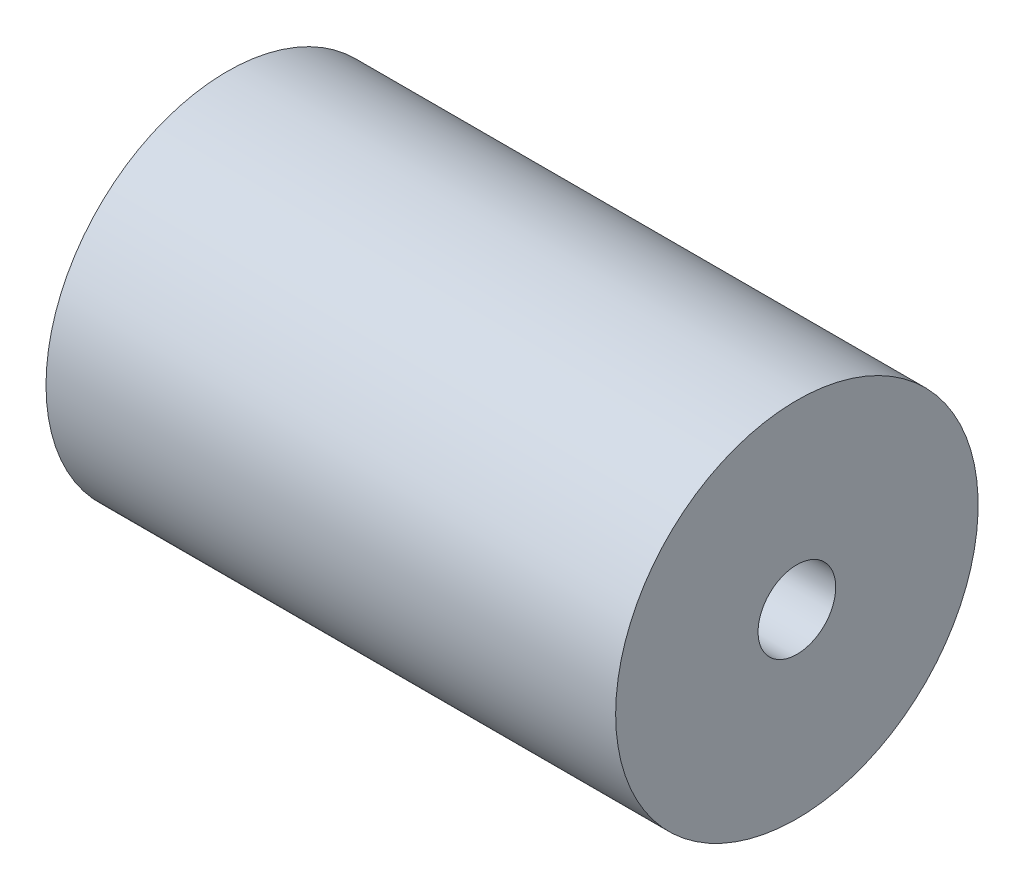
ISO-10303-21;
HEADER;
FILE_DESCRIPTION(('STEP AP214'),'2;1');
FILE_NAME('part.step','',(''),(''),'','','');
FILE_SCHEMA(('AUTOMOTIVE_DESIGN { 1 0 10303 214 1 1 1 1 }'));
ENDSEC;
DATA;
#1=APPLICATION_CONTEXT('core data for automotive mechanical design processes');
#2=APPLICATION_PROTOCOL_DEFINITION('international standard','automotive_design',2000,#1);
#3=PRODUCT_CONTEXT('',#1,'mechanical');
#4=PRODUCT('Part','Part','',(#3));
#5=PRODUCT_RELATED_PRODUCT_CATEGORY('part','',(#4));
#6=PRODUCT_DEFINITION_FORMATION('','',#4);
#7=PRODUCT_DEFINITION_CONTEXT('part definition',#1,'design');
#8=PRODUCT_DEFINITION('design','',#6,#7);
#9=PRODUCT_DEFINITION_SHAPE('','',#8);
#10=(LENGTH_UNIT() NAMED_UNIT(*) SI_UNIT(.MILLI.,.METRE.));
#11=(NAMED_UNIT(*) PLANE_ANGLE_UNIT() SI_UNIT($,.RADIAN.));
#12=(NAMED_UNIT(*) SI_UNIT($,.STERADIAN.) SOLID_ANGLE_UNIT());
#13=UNCERTAINTY_MEASURE_WITH_UNIT(LENGTH_MEASURE(1.E-05),#10,'distance_accuracy_value','');
#14=(GEOMETRIC_REPRESENTATION_CONTEXT(3) GLOBAL_UNCERTAINTY_ASSIGNED_CONTEXT((#13)) GLOBAL_UNIT_ASSIGNED_CONTEXT((#10,
#11,#12)) REPRESENTATION_CONTEXT('',''));
#15=CARTESIAN_POINT('',(0.,0.,0.));
#16=DIRECTION('',(0.,0.,1.));
#17=DIRECTION('',(1.,0.,0.));
#18=AXIS2_PLACEMENT_3D('',#15,#16,#17);
#19=CARTESIAN_POINT('',(0.,0.,0.));
#20=DIRECTION('',(-1.,0.,0.));
#21=DIRECTION('',(0.,0.,1.));
#22=AXIS2_PLACEMENT_3D('',#19,#20,#21);
#23=CYLINDRICAL_SURFACE('',#22,3.);
#24=CARTESIAN_POINT('',(-11.,0.,0.));
#25=DIRECTION('',(-1.,0.,0.));
#26=DIRECTION('',(0.,0.,1.));
#27=AXIS2_PLACEMENT_3D('',#24,#25,#26);
#28=CIRCLE('',#27,3.);
#29=CARTESIAN_POINT('',(-11.,0.,3.));
#30=VERTEX_POINT('',#29);
#31=EDGE_CURVE('E48',#30,#30,#28,.T.);
#32=ORIENTED_EDGE('',*,*,#31,.T.);
#33=EDGE_LOOP('',(#32));
#34=FACE_BOUND('',#33,.T.);
#35=CARTESIAN_POINT('',(6.,0.,0.));
#36=DIRECTION('',(1.,0.,0.));
#37=DIRECTION('',(0.,0.,-1.));
#38=AXIS2_PLACEMENT_3D('',#35,#36,#37);
#39=CIRCLE('',#38,3.);
#40=CARTESIAN_POINT('',(6.,0.,-3.));
#41=VERTEX_POINT('',#40);
#42=EDGE_CURVE('E10',#41,#41,#39,.F.);
#43=ORIENTED_EDGE('',*,*,#42,.F.);
#44=EDGE_LOOP('',(#43));
#45=FACE_BOUND('',#44,.T.);
#46=ADVANCED_FACE('F41',(#34,#45),#23,.F.);
#47=CARTESIAN_POINT('',(11.,3.,0.));
#48=DIRECTION('',(-1.,0.,0.));
#49=DIRECTION('',(0.,0.,1.));
#50=AXIS2_PLACEMENT_3D('',#47,#48,#49);
#51=PLANE('',#50);
#52=CARTESIAN_POINT('',(11.,0.,0.));
#53=DIRECTION('',(-1.,0.,0.));
#54=DIRECTION('',(0.,0.,1.));
#55=AXIS2_PLACEMENT_3D('',#52,#53,#54);
#56=CIRCLE('',#55,7.);
#57=CARTESIAN_POINT('',(11.,0.,7.));
#58=VERTEX_POINT('',#57);
#59=EDGE_CURVE('E56',#58,#58,#56,.T.);
#60=ORIENTED_EDGE('',*,*,#59,.F.);
#61=EDGE_LOOP('',(#60));
#62=FACE_BOUND('',#61,.T.);
#63=CARTESIAN_POINT('',(11.,0.,0.));
#64=DIRECTION('',(1.,0.,0.));
#65=DIRECTION('',(0.,0.,-1.));
#66=AXIS2_PLACEMENT_3D('',#63,#64,#65);
#67=CIRCLE('',#66,1.5);
#68=CARTESIAN_POINT('',(11.,0.,-1.5));
#69=VERTEX_POINT('',#68);
#70=EDGE_CURVE('E62',#69,#69,#67,.T.);
#71=ORIENTED_EDGE('',*,*,#70,.F.);
#72=EDGE_LOOP('',(#71));
#73=FACE_BOUND('',#72,.T.);
#74=ADVANCED_FACE('F43',(#62,#73),#51,.F.);
#75=CARTESIAN_POINT('',(-11.,3.,0.));
#76=DIRECTION('',(1.,0.,0.));
#77=DIRECTION('',(0.,0.,-1.));
#78=AXIS2_PLACEMENT_3D('',#75,#76,#77);
#79=PLANE('',#78);
#80=ORIENTED_EDGE('',*,*,#31,.F.);
#81=EDGE_LOOP('',(#80));
#82=FACE_BOUND('',#81,.T.);
#83=CARTESIAN_POINT('',(-11.,0.,0.));
#84=DIRECTION('',(-1.,0.,0.));
#85=DIRECTION('',(0.,0.,1.));
#86=AXIS2_PLACEMENT_3D('',#83,#84,#85);
#87=CIRCLE('',#86,7.);
#88=CARTESIAN_POINT('',(-11.,0.,7.));
#89=VERTEX_POINT('',#88);
#90=EDGE_CURVE('E52',#89,#89,#87,.T.);
#91=ORIENTED_EDGE('',*,*,#90,.T.);
#92=EDGE_LOOP('',(#91));
#93=FACE_BOUND('',#92,.T.);
#94=ADVANCED_FACE('F77',(#82,#93),#79,.F.);
#95=CARTESIAN_POINT('',(0.,0.,0.));
#96=DIRECTION('',(-1.,0.,0.));
#97=DIRECTION('',(0.,0.,1.));
#98=AXIS2_PLACEMENT_3D('',#95,#96,#97);
#99=CYLINDRICAL_SURFACE('',#98,7.);
#100=ORIENTED_EDGE('',*,*,#90,.F.);
#101=EDGE_LOOP('',(#100));
#102=FACE_BOUND('',#101,.T.);
#103=ORIENTED_EDGE('',*,*,#59,.T.);
#104=EDGE_LOOP('',(#103));
#105=FACE_BOUND('',#104,.T.);
#106=ADVANCED_FACE('F84',(#102,#105),#99,.T.);
#107=CARTESIAN_POINT('',(6.,0.,0.));
#108=DIRECTION('',(1.,0.,0.));
#109=DIRECTION('',(0.,0.,-1.));
#110=AXIS2_PLACEMENT_3D('',#107,#108,#109);
#111=PLANE('',#110);
#112=CARTESIAN_POINT('',(6.,0.,0.));
#113=DIRECTION('',(1.,0.,0.));
#114=DIRECTION('',(0.,0.,-1.));
#115=AXIS2_PLACEMENT_3D('',#112,#113,#114);
#116=CIRCLE('',#115,1.5);
#117=CARTESIAN_POINT('',(6.,0.,-1.5));
#118=VERTEX_POINT('',#117);
#119=EDGE_CURVE('E61',#118,#118,#116,.T.);
#120=ORIENTED_EDGE('',*,*,#119,.T.);
#121=EDGE_LOOP('',(#120));
#122=FACE_BOUND('',#121,.T.);
#123=ORIENTED_EDGE('',*,*,#42,.T.);
#124=EDGE_LOOP('',(#123));
#125=FACE_BOUND('',#124,.T.);
#126=ADVANCED_FACE('F68',(#122,#125),#111,.F.);
#127=CARTESIAN_POINT('',(6.,0.,0.));
#128=DIRECTION('',(1.,0.,0.));
#129=DIRECTION('',(0.,0.,-1.));
#130=AXIS2_PLACEMENT_3D('',#127,#128,#129);
#131=CYLINDRICAL_SURFACE('',#130,1.5);
#132=ORIENTED_EDGE('',*,*,#119,.F.);
#133=EDGE_LOOP('',(#132));
#134=FACE_BOUND('',#133,.T.);
#135=ORIENTED_EDGE('',*,*,#70,.T.);
#136=EDGE_LOOP('',(#135));
#137=FACE_BOUND('',#136,.T.);
#138=ADVANCED_FACE('F70',(#134,#137),#131,.F.);
#139=CLOSED_SHELL('',(#46,#74,#94,#106,#126,#138));
#140=MANIFOLD_SOLID_BREP('B2',#139);
#141=ADVANCED_BREP_SHAPE_REPRESENTATION('',(#18,#140),#14);
#142=SHAPE_DEFINITION_REPRESENTATION(#9,#141);
ENDSEC;
END-ISO-10303-21;
